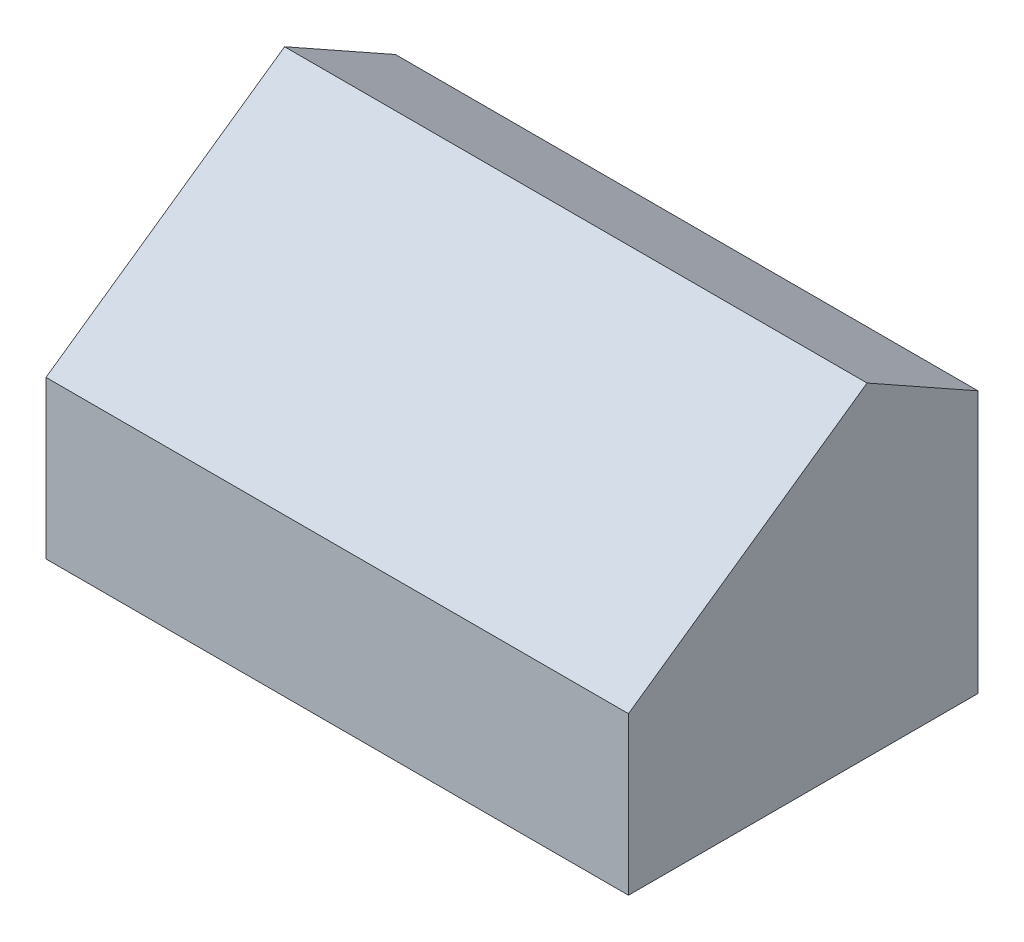
ISO-10303-21;
HEADER;
FILE_DESCRIPTION(('STEP AP214'),'2;1');
FILE_NAME('part.step','',(''),(''),'','','');
FILE_SCHEMA(('AUTOMOTIVE_DESIGN { 1 0 10303 214 1 1 1 1 }'));
ENDSEC;
DATA;
#1=APPLICATION_CONTEXT('core data for automotive mechanical design processes');
#2=APPLICATION_PROTOCOL_DEFINITION('international standard','automotive_design',2000,#1);
#3=PRODUCT_CONTEXT('',#1,'mechanical');
#4=PRODUCT('Part','Part','',(#3));
#5=PRODUCT_RELATED_PRODUCT_CATEGORY('part','',(#4));
#6=PRODUCT_DEFINITION_FORMATION('','',#4);
#7=PRODUCT_DEFINITION_CONTEXT('part definition',#1,'design');
#8=PRODUCT_DEFINITION('design','',#6,#7);
#9=PRODUCT_DEFINITION_SHAPE('','',#8);
#10=(LENGTH_UNIT() NAMED_UNIT(*) SI_UNIT(.MILLI.,.METRE.));
#11=(NAMED_UNIT(*) PLANE_ANGLE_UNIT() SI_UNIT($,.RADIAN.));
#12=(NAMED_UNIT(*) SI_UNIT($,.STERADIAN.) SOLID_ANGLE_UNIT());
#13=UNCERTAINTY_MEASURE_WITH_UNIT(LENGTH_MEASURE(1.E-05),#10,'distance_accuracy_value','');
#14=(GEOMETRIC_REPRESENTATION_CONTEXT(3) GLOBAL_UNCERTAINTY_ASSIGNED_CONTEXT((#13)) GLOBAL_UNIT_ASSIGNED_CONTEXT((#10,
#11,#12)) REPRESENTATION_CONTEXT('',''));
#15=CARTESIAN_POINT('',(0.,0.,0.));
#16=DIRECTION('',(0.,0.,1.));
#17=DIRECTION('',(1.,0.,0.));
#18=AXIS2_PLACEMENT_3D('',#15,#16,#17);
#19=CARTESIAN_POINT('',(100.,0.,-60.));
#20=DIRECTION('',(0.,1.,0.));
#21=DIRECTION('',(0.,0.,1.));
#22=AXIS2_PLACEMENT_3D('',#19,#20,#21);
#23=PLANE('',#22);
#24=DIRECTION('',(0.,0.,-1.));
#25=VECTOR('',#24,1.);
#26=CARTESIAN_POINT('',(0.,0.,-60.));
#27=LINE('',#26,#25);
#28=CARTESIAN_POINT('',(0.,0.,0.));
#29=VERTEX_POINT('',#28);
#30=CARTESIAN_POINT('',(0.,0.,-60.));
#31=VERTEX_POINT('',#30);
#32=EDGE_CURVE('E107',#29,#31,#27,.T.);
#33=ORIENTED_EDGE('',*,*,#32,.T.);
#34=DIRECTION('',(-1.,0.,0.));
#35=VECTOR('',#34,1.);
#36=CARTESIAN_POINT('',(100.,0.,-60.));
#37=LINE('',#36,#35);
#38=CARTESIAN_POINT('',(100.,0.,-60.));
#39=VERTEX_POINT('',#38);
#40=EDGE_CURVE('E11',#39,#31,#37,.T.);
#41=ORIENTED_EDGE('',*,*,#40,.F.);
#42=DIRECTION('',(0.,0.,-1.));
#43=VECTOR('',#42,1.);
#44=CARTESIAN_POINT('',(100.,0.,-60.));
#45=LINE('',#44,#43);
#46=CARTESIAN_POINT('',(100.,0.,0.));
#47=VERTEX_POINT('',#46);
#48=EDGE_CURVE('E115',#47,#39,#45,.T.);
#49=ORIENTED_EDGE('',*,*,#48,.F.);
#50=DIRECTION('',(-1.,0.,0.));
#51=VECTOR('',#50,1.);
#52=CARTESIAN_POINT('',(100.,0.,0.));
#53=LINE('',#52,#51);
#54=EDGE_CURVE('E103',#47,#29,#53,.T.);
#55=ORIENTED_EDGE('',*,*,#54,.T.);
#56=EDGE_LOOP('',(#33,#41,#49,#55));
#57=FACE_BOUND('',#56,.T.);
#58=ADVANCED_FACE('F33',(#57),#23,.F.);
#59=CARTESIAN_POINT('',(100.,45.,-60.));
#60=DIRECTION('',(0.,0.,1.));
#61=DIRECTION('',(0.,-1.,0.));
#62=AXIS2_PLACEMENT_3D('',#59,#60,#61);
#63=PLANE('',#62);
#64=DIRECTION('',(0.,1.,0.));
#65=VECTOR('',#64,1.);
#66=CARTESIAN_POINT('',(0.,45.,-60.));
#67=LINE('',#66,#65);
#68=CARTESIAN_POINT('',(0.,45.,-60.));
#69=VERTEX_POINT('',#68);
#70=EDGE_CURVE('E110',#31,#69,#67,.T.);
#71=ORIENTED_EDGE('',*,*,#70,.T.);
#72=DIRECTION('',(-1.,0.,0.));
#73=VECTOR('',#72,1.);
#74=CARTESIAN_POINT('',(100.,45.,-60.));
#75=LINE('',#74,#73);
#76=CARTESIAN_POINT('',(100.,45.,-60.));
#77=VERTEX_POINT('',#76);
#78=EDGE_CURVE('E41',#77,#69,#75,.T.);
#79=ORIENTED_EDGE('',*,*,#78,.F.);
#80=DIRECTION('',(0.,1.,0.));
#81=VECTOR('',#80,1.);
#82=CARTESIAN_POINT('',(100.,45.,-60.));
#83=LINE('',#82,#81);
#84=EDGE_CURVE('E83',#39,#77,#83,.T.);
#85=ORIENTED_EDGE('',*,*,#84,.F.);
#86=ORIENTED_EDGE('',*,*,#40,.T.);
#87=EDGE_LOOP('',(#71,#79,#85,#86));
#88=FACE_BOUND('',#87,.T.);
#89=ADVANCED_FACE('F134',(#88),#63,.F.);
#90=CARTESIAN_POINT('',(100.,55.6788218175521,-40.9576022144497));
#91=DIRECTION('',(0.,-0.872211415888584,0.489129068849554));
#92=DIRECTION('',(0.,-0.489129068849554,-0.872211415888584));
#93=AXIS2_PLACEMENT_3D('',#90,#91,#92);
#94=PLANE('',#93);
#95=DIRECTION('',(0.,0.489129068849554,0.872211415888584));
#96=VECTOR('',#95,1.);
#97=CARTESIAN_POINT('',(0.,55.6788218175521,-40.9576022144497));
#98=LINE('',#97,#96);
#99=CARTESIAN_POINT('',(0.,55.6788218175521,-40.9576022144497));
#100=VERTEX_POINT('',#99);
#101=EDGE_CURVE('E98',#69,#100,#98,.T.);
#102=ORIENTED_EDGE('',*,*,#101,.T.);
#103=DIRECTION('',(-1.,0.,0.));
#104=VECTOR('',#103,1.);
#105=CARTESIAN_POINT('',(100.,55.6788218175521,-40.9576022144497));
#106=LINE('',#105,#104);
#107=CARTESIAN_POINT('',(100.,55.6788218175521,-40.9576022144497));
#108=VERTEX_POINT('',#107);
#109=EDGE_CURVE('E95',#108,#100,#106,.T.);
#110=ORIENTED_EDGE('',*,*,#109,.F.);
#111=DIRECTION('',(0.,0.489129068849554,0.872211415888584));
#112=VECTOR('',#111,1.);
#113=CARTESIAN_POINT('',(100.,55.6788218175521,-40.9576022144497));
#114=LINE('',#113,#112);
#115=EDGE_CURVE('E87',#77,#108,#114,.T.);
#116=ORIENTED_EDGE('',*,*,#115,.F.);
#117=ORIENTED_EDGE('',*,*,#78,.T.);
#118=EDGE_LOOP('',(#102,#110,#116,#117));
#119=FACE_BOUND('',#118,.T.);
#120=ADVANCED_FACE('F96',(#119),#94,.F.);
#121=CARTESIAN_POINT('',(100.,27.,0.));
#122=DIRECTION('',(0.,-0.819152044288995,-0.573576436351042));
#123=DIRECTION('',(0.,0.573576436351042,-0.819152044288995));
#124=AXIS2_PLACEMENT_3D('',#121,#122,#123);
#125=PLANE('',#124);
#126=DIRECTION('',(0.,-0.573576436351042,0.819152044288995));
#127=VECTOR('',#126,1.);
#128=CARTESIAN_POINT('',(0.,27.,0.));
#129=LINE('',#128,#127);
#130=CARTESIAN_POINT('',(0.,27.,0.));
#131=VERTEX_POINT('',#130);
#132=EDGE_CURVE('E69',#100,#131,#129,.T.);
#133=ORIENTED_EDGE('',*,*,#132,.T.);
#134=DIRECTION('',(-1.,0.,0.));
#135=VECTOR('',#134,1.);
#136=CARTESIAN_POINT('',(100.,27.,0.));
#137=LINE('',#136,#135);
#138=CARTESIAN_POINT('',(100.,27.,0.));
#139=VERTEX_POINT('',#138);
#140=EDGE_CURVE('E99',#139,#131,#137,.T.);
#141=ORIENTED_EDGE('',*,*,#140,.F.);
#142=DIRECTION('',(0.,-0.573576436351042,0.819152044288995));
#143=VECTOR('',#142,1.);
#144=CARTESIAN_POINT('',(100.,27.,0.));
#145=LINE('',#144,#143);
#146=EDGE_CURVE('E91',#108,#139,#145,.T.);
#147=ORIENTED_EDGE('',*,*,#146,.F.);
#148=ORIENTED_EDGE('',*,*,#109,.T.);
#149=EDGE_LOOP('',(#133,#141,#147,#148));
#150=FACE_BOUND('',#149,.T.);
#151=ADVANCED_FACE('F101',(#150),#125,.F.);
#152=CARTESIAN_POINT('',(100.,0.,0.));
#153=DIRECTION('',(0.,0.,-1.));
#154=DIRECTION('',(-1.,0.,0.));
#155=AXIS2_PLACEMENT_3D('',#152,#153,#154);
#156=PLANE('',#155);
#157=DIRECTION('',(0.,-1.,0.));
#158=VECTOR('',#157,1.);
#159=CARTESIAN_POINT('',(0.,0.,0.));
#160=LINE('',#159,#158);
#161=EDGE_CURVE('E75',#131,#29,#160,.T.);
#162=ORIENTED_EDGE('',*,*,#161,.T.);
#163=ORIENTED_EDGE('',*,*,#54,.F.);
#164=DIRECTION('',(0.,-1.,0.));
#165=VECTOR('',#164,1.);
#166=CARTESIAN_POINT('',(100.,0.,0.));
#167=LINE('',#166,#165);
#168=EDGE_CURVE('E49',#139,#47,#167,.T.);
#169=ORIENTED_EDGE('',*,*,#168,.F.);
#170=ORIENTED_EDGE('',*,*,#140,.T.);
#171=EDGE_LOOP('',(#162,#163,#169,#170));
#172=FACE_BOUND('',#171,.T.);
#173=ADVANCED_FACE('F123',(#172),#156,.F.);
#174=CARTESIAN_POINT('',(100.,0.,0.));
#175=DIRECTION('',(-1.,0.,0.));
#176=DIRECTION('',(0.,0.,1.));
#177=AXIS2_PLACEMENT_3D('',#174,#175,#176);
#178=PLANE('',#177);
#179=ORIENTED_EDGE('',*,*,#48,.T.);
#180=ORIENTED_EDGE('',*,*,#84,.T.);
#181=ORIENTED_EDGE('',*,*,#115,.T.);
#182=ORIENTED_EDGE('',*,*,#146,.T.);
#183=ORIENTED_EDGE('',*,*,#168,.T.);
#184=EDGE_LOOP('',(#179,#180,#181,#182,#183));
#185=FACE_BOUND('',#184,.T.);
#186=ADVANCED_FACE('F89',(#185),#178,.F.);
#187=CARTESIAN_POINT('',(0.,0.,0.));
#188=DIRECTION('',(-1.,0.,0.));
#189=DIRECTION('',(0.,0.,1.));
#190=AXIS2_PLACEMENT_3D('',#187,#188,#189);
#191=PLANE('',#190);
#192=ORIENTED_EDGE('',*,*,#32,.F.);
#193=ORIENTED_EDGE('',*,*,#161,.F.);
#194=ORIENTED_EDGE('',*,*,#132,.F.);
#195=ORIENTED_EDGE('',*,*,#101,.F.);
#196=ORIENTED_EDGE('',*,*,#70,.F.);
#197=EDGE_LOOP('',(#192,#193,#194,#195,#196));
#198=FACE_BOUND('',#197,.T.);
#199=ADVANCED_FACE('F119',(#198),#191,.T.);
#200=CLOSED_SHELL('',(#58,#89,#120,#151,#173,#186,#199));
#201=MANIFOLD_SOLID_BREP('B2',#200);
#202=ADVANCED_BREP_SHAPE_REPRESENTATION('',(#18,#201),#14);
#203=SHAPE_DEFINITION_REPRESENTATION(#9,#202);
ENDSEC;
END-ISO-10303-21;
